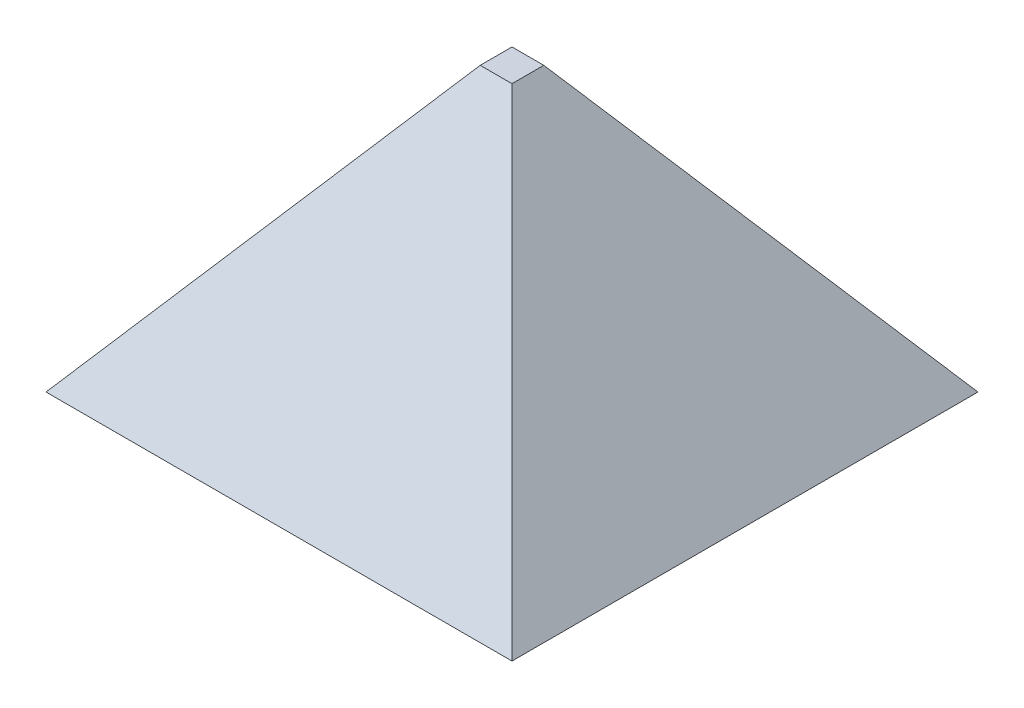
ISO-10303-21;
HEADER;
FILE_DESCRIPTION(('STEP AP214'),'2;1');
FILE_NAME('part.step','',(''),(''),'','','');
FILE_SCHEMA(('AUTOMOTIVE_DESIGN { 1 0 10303 214 1 1 1 1 }'));
ENDSEC;
DATA;
#1=APPLICATION_CONTEXT('core data for automotive mechanical design processes');
#2=APPLICATION_PROTOCOL_DEFINITION('international standard','automotive_design',2000,#1);
#3=PRODUCT_CONTEXT('',#1,'mechanical');
#4=PRODUCT('Part','Part','',(#3));
#5=PRODUCT_RELATED_PRODUCT_CATEGORY('part','',(#4));
#6=PRODUCT_DEFINITION_FORMATION('','',#4);
#7=PRODUCT_DEFINITION_CONTEXT('part definition',#1,'design');
#8=PRODUCT_DEFINITION('design','',#6,#7);
#9=PRODUCT_DEFINITION_SHAPE('','',#8);
#10=(LENGTH_UNIT() NAMED_UNIT(*) SI_UNIT(.MILLI.,.METRE.));
#11=(NAMED_UNIT(*) PLANE_ANGLE_UNIT() SI_UNIT($,.RADIAN.));
#12=(NAMED_UNIT(*) SI_UNIT($,.STERADIAN.) SOLID_ANGLE_UNIT());
#13=UNCERTAINTY_MEASURE_WITH_UNIT(LENGTH_MEASURE(1.E-05),#10,'distance_accuracy_value','');
#14=(GEOMETRIC_REPRESENTATION_CONTEXT(3) GLOBAL_UNCERTAINTY_ASSIGNED_CONTEXT((#13)) GLOBAL_UNIT_ASSIGNED_CONTEXT((#10,
#11,#12)) REPRESENTATION_CONTEXT('',''));
#15=CARTESIAN_POINT('',(0.,0.,0.));
#16=DIRECTION('',(0.,0.,1.));
#17=DIRECTION('',(1.,0.,0.));
#18=AXIS2_PLACEMENT_3D('',#15,#16,#17);
#19=CARTESIAN_POINT('',(-14.,0.,-14.));
#20=DIRECTION('',(-0.793353340291234,0.608761429008722,0.));
#21=DIRECTION('',(-0.608761429008722,-0.793353340291234,0.));
#22=AXIS2_PLACEMENT_3D('',#19,#20,#21);
#23=PLANE('',#22);
#24=DIRECTION('',(0.,0.,1.));
#25=VECTOR('',#24,1.);
#26=CARTESIAN_POINT('',(-14.,0.,-14.));
#27=LINE('',#26,#25);
#28=CARTESIAN_POINT('',(-14.,0.,-14.));
#29=VERTEX_POINT('',#28);
#30=CARTESIAN_POINT('',(-14.,0.,14.));
#31=VERTEX_POINT('',#30);
#32=EDGE_CURVE('E79',#29,#31,#27,.T.);
#33=ORIENTED_EDGE('',*,*,#32,.T.);
#34=DIRECTION('',(-0.519987941853022,-0.677661479394334,0.519987941853022));
#35=VECTOR('',#34,1.);
#36=CARTESIAN_POINT('',(-6.42915112916883,9.86652234241333,6.42915112916882));
#37=LINE('',#36,#35);
#38=CARTESIAN_POINT('',(-0.955441204357635,17.,0.955441204357621));
#39=VERTEX_POINT('',#38);
#40=EDGE_CURVE('E11',#39,#31,#37,.T.);
#41=ORIENTED_EDGE('',*,*,#40,.F.);
#42=DIRECTION('',(0.,0.,-1.));
#43=VECTOR('',#42,1.);
#44=CARTESIAN_POINT('',(-0.955441204357634,17.,0.));
#45=LINE('',#44,#43);
#46=CARTESIAN_POINT('',(-0.955441204357635,17.,-0.955441204357647));
#47=VERTEX_POINT('',#46);
#48=EDGE_CURVE('E95',#47,#39,#45,.F.);
#49=ORIENTED_EDGE('',*,*,#48,.F.);
#50=DIRECTION('',(-0.519987941853022,-0.677661479394334,-0.519987941853022));
#51=VECTOR('',#50,1.);
#52=CARTESIAN_POINT('',(-14.,0.,-14.));
#53=LINE('',#52,#51);
#54=EDGE_CURVE('E90',#47,#29,#53,.T.);
#55=ORIENTED_EDGE('',*,*,#54,.T.);
#56=EDGE_LOOP('',(#33,#41,#49,#55));
#57=FACE_BOUND('',#56,.T.);
#58=ADVANCED_FACE('F33',(#57),#23,.T.);
#59=CARTESIAN_POINT('',(14.,0.,14.));
#60=DIRECTION('',(0.,0.608761429008722,0.793353340291234));
#61=DIRECTION('',(0.,-0.793353340291234,0.608761429008722));
#62=AXIS2_PLACEMENT_3D('',#59,#60,#61);
#63=PLANE('',#62);
#64=DIRECTION('',(1.,0.,0.));
#65=VECTOR('',#64,1.);
#66=CARTESIAN_POINT('',(14.,0.,14.));
#67=LINE('',#66,#65);
#68=CARTESIAN_POINT('',(14.,0.,14.));
#69=VERTEX_POINT('',#68);
#70=EDGE_CURVE('E75',#31,#69,#67,.T.);
#71=ORIENTED_EDGE('',*,*,#70,.T.);
#72=DIRECTION('',(0.519987941853022,-0.677661479394334,0.519987941853022));
#73=VECTOR('',#72,1.);
#74=CARTESIAN_POINT('',(6.42915112916883,9.86652234241333,6.42915112916882));
#75=LINE('',#74,#73);
#76=CARTESIAN_POINT('',(0.955441204357631,17.,0.955441204357621));
#77=VERTEX_POINT('',#76);
#78=EDGE_CURVE('E42',#77,#69,#75,.T.);
#79=ORIENTED_EDGE('',*,*,#78,.F.);
#80=DIRECTION('',(-1.,0.,0.));
#81=VECTOR('',#80,1.);
#82=CARTESIAN_POINT('',(0.,17.,0.95544120435762));
#83=LINE('',#82,#81);
#84=EDGE_CURVE('E86',#39,#77,#83,.F.);
#85=ORIENTED_EDGE('',*,*,#84,.F.);
#86=ORIENTED_EDGE('',*,*,#40,.T.);
#87=EDGE_LOOP('',(#71,#79,#85,#86));
#88=FACE_BOUND('',#87,.T.);
#89=ADVANCED_FACE('F35',(#88),#63,.T.);
#90=CARTESIAN_POINT('',(14.,0.,-14.));
#91=DIRECTION('',(0.793353340291234,0.608761429008722,0.));
#92=DIRECTION('',(-0.608761429008722,0.793353340291234,0.));
#93=AXIS2_PLACEMENT_3D('',#90,#91,#92);
#94=PLANE('',#93);
#95=DIRECTION('',(0.,0.,-1.));
#96=VECTOR('',#95,1.);
#97=CARTESIAN_POINT('',(14.,0.,-14.));
#98=LINE('',#97,#96);
#99=CARTESIAN_POINT('',(14.,0.,-14.));
#100=VERTEX_POINT('',#99);
#101=EDGE_CURVE('E80',#69,#100,#98,.T.);
#102=ORIENTED_EDGE('',*,*,#101,.T.);
#103=DIRECTION('',(0.519987941853022,-0.677661479394334,-0.519987941853022));
#104=VECTOR('',#103,1.);
#105=CARTESIAN_POINT('',(14.,0.,-14.));
#106=LINE('',#105,#104);
#107=CARTESIAN_POINT('',(0.955441204357631,17.,-0.955441204357647));
#108=VERTEX_POINT('',#107);
#109=EDGE_CURVE('E98',#108,#100,#106,.T.);
#110=ORIENTED_EDGE('',*,*,#109,.F.);
#111=DIRECTION('',(0.,0.,1.));
#112=VECTOR('',#111,1.);
#113=CARTESIAN_POINT('',(0.955441204357631,17.,0.));
#114=LINE('',#113,#112);
#115=EDGE_CURVE('E54',#77,#108,#114,.F.);
#116=ORIENTED_EDGE('',*,*,#115,.F.);
#117=ORIENTED_EDGE('',*,*,#78,.T.);
#118=EDGE_LOOP('',(#102,#110,#116,#117));
#119=FACE_BOUND('',#118,.T.);
#120=ADVANCED_FACE('F105',(#119),#94,.T.);
#121=CARTESIAN_POINT('',(14.,0.,-14.));
#122=DIRECTION('',(0.,0.608761429008722,-0.793353340291234));
#123=DIRECTION('',(0.,0.793353340291234,0.608761429008722));
#124=AXIS2_PLACEMENT_3D('',#121,#122,#123);
#125=PLANE('',#124);
#126=DIRECTION('',(-1.,0.,0.));
#127=VECTOR('',#126,1.);
#128=CARTESIAN_POINT('',(14.,0.,-14.));
#129=LINE('',#128,#127);
#130=EDGE_CURVE('E94',#100,#29,#129,.T.);
#131=ORIENTED_EDGE('',*,*,#130,.T.);
#132=ORIENTED_EDGE('',*,*,#54,.F.);
#133=DIRECTION('',(1.,0.,0.));
#134=VECTOR('',#133,1.);
#135=CARTESIAN_POINT('',(0.,17.,-0.955441204357647));
#136=LINE('',#135,#134);
#137=EDGE_CURVE('E37',#108,#47,#136,.F.);
#138=ORIENTED_EDGE('',*,*,#137,.F.);
#139=ORIENTED_EDGE('',*,*,#109,.T.);
#140=EDGE_LOOP('',(#131,#132,#138,#139));
#141=FACE_BOUND('',#140,.T.);
#142=ADVANCED_FACE('F107',(#141),#125,.T.);
#143=CARTESIAN_POINT('',(0.,17.,0.));
#144=DIRECTION('',(0.,-1.,0.));
#145=DIRECTION('',(0.,0.,-1.));
#146=AXIS2_PLACEMENT_3D('',#143,#144,#145);
#147=PLANE('',#146);
#148=ORIENTED_EDGE('',*,*,#48,.T.);
#149=ORIENTED_EDGE('',*,*,#84,.T.);
#150=ORIENTED_EDGE('',*,*,#115,.T.);
#151=ORIENTED_EDGE('',*,*,#137,.T.);
#152=EDGE_LOOP('',(#148,#149,#150,#151));
#153=FACE_BOUND('',#152,.T.);
#154=ADVANCED_FACE('F103',(#153),#147,.F.);
#155=CARTESIAN_POINT('',(0.,0.,0.));
#156=DIRECTION('',(0.,-1.,0.));
#157=DIRECTION('',(0.,0.,-1.));
#158=AXIS2_PLACEMENT_3D('',#155,#156,#157);
#159=PLANE('',#158);
#160=ORIENTED_EDGE('',*,*,#32,.F.);
#161=ORIENTED_EDGE('',*,*,#130,.F.);
#162=ORIENTED_EDGE('',*,*,#101,.F.);
#163=ORIENTED_EDGE('',*,*,#70,.F.);
#164=EDGE_LOOP('',(#160,#161,#162,#163));
#165=FACE_BOUND('',#164,.T.);
#166=ADVANCED_FACE('F76',(#165),#159,.T.);
#167=CLOSED_SHELL('',(#58,#89,#120,#142,#154,#166));
#168=MANIFOLD_SOLID_BREP('B2',#167);
#169=ADVANCED_BREP_SHAPE_REPRESENTATION('',(#18,#168),#14);
#170=SHAPE_DEFINITION_REPRESENTATION(#9,#169);
ENDSEC;
END-ISO-10303-21;
